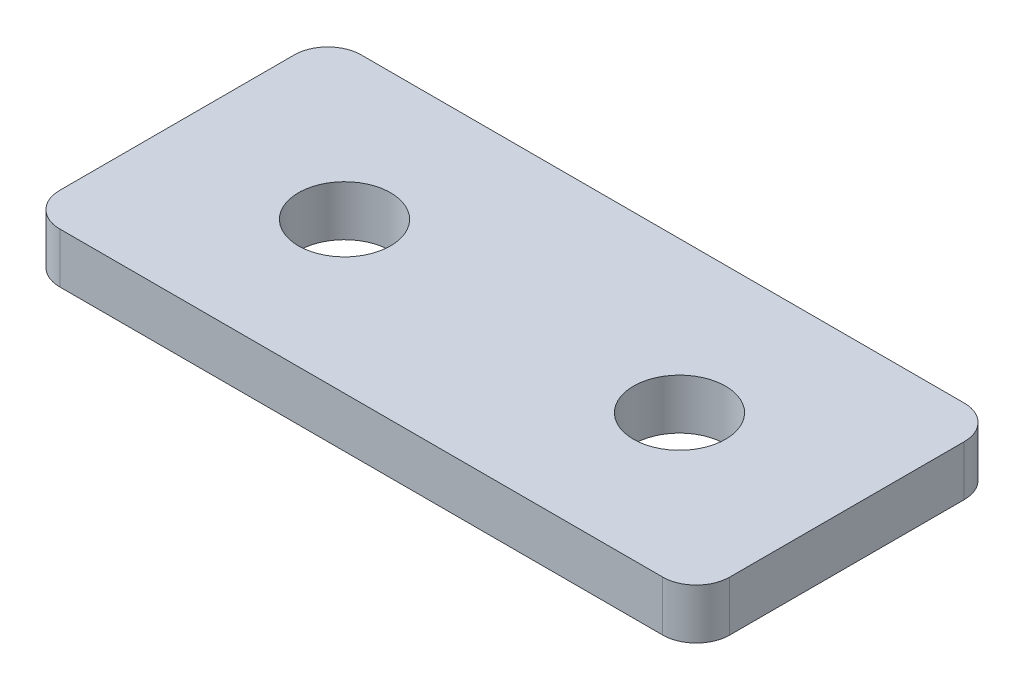
ISO-10303-21;
HEADER;
FILE_DESCRIPTION(('STEP AP214'),'2;1');
FILE_NAME('part.step','',(''),(''),'','','');
FILE_SCHEMA(('AUTOMOTIVE_DESIGN { 1 0 10303 214 1 1 1 1 }'));
ENDSEC;
DATA;
#1=APPLICATION_CONTEXT('core data for automotive mechanical design processes');
#2=APPLICATION_PROTOCOL_DEFINITION('international standard','automotive_design',2000,#1);
#3=PRODUCT_CONTEXT('',#1,'mechanical');
#4=PRODUCT('Part','Part','',(#3));
#5=PRODUCT_RELATED_PRODUCT_CATEGORY('part','',(#4));
#6=PRODUCT_DEFINITION_FORMATION('','',#4);
#7=PRODUCT_DEFINITION_CONTEXT('part definition',#1,'design');
#8=PRODUCT_DEFINITION('design','',#6,#7);
#9=PRODUCT_DEFINITION_SHAPE('','',#8);
#10=(LENGTH_UNIT() NAMED_UNIT(*) SI_UNIT(.MILLI.,.METRE.));
#11=(NAMED_UNIT(*) PLANE_ANGLE_UNIT() SI_UNIT($,.RADIAN.));
#12=(NAMED_UNIT(*) SI_UNIT($,.STERADIAN.) SOLID_ANGLE_UNIT());
#13=UNCERTAINTY_MEASURE_WITH_UNIT(LENGTH_MEASURE(1.E-05),#10,'distance_accuracy_value','');
#14=(GEOMETRIC_REPRESENTATION_CONTEXT(3) GLOBAL_UNCERTAINTY_ASSIGNED_CONTEXT((#13)) GLOBAL_UNIT_ASSIGNED_CONTEXT((#10,
#11,#12)) REPRESENTATION_CONTEXT('',''));
#15=CARTESIAN_POINT('',(0.,0.,0.));
#16=DIRECTION('',(0.,0.,1.));
#17=DIRECTION('',(1.,0.,0.));
#18=AXIS2_PLACEMENT_3D('',#15,#16,#17);
#19=CARTESIAN_POINT('',(18.,3.,-7.));
#20=DIRECTION('',(0.,-1.,0.));
#21=DIRECTION('',(0.,0.,-1.));
#22=AXIS2_PLACEMENT_3D('',#19,#20,#21);
#23=PLANE('',#22);
#24=CARTESIAN_POINT('',(18.,3.,-7.));
#25=DIRECTION('',(0.,1.,0.));
#26=DIRECTION('',(0.,0.,-1.));
#27=AXIS2_PLACEMENT_3D('',#24,#25,#26);
#28=CIRCLE('',#27,2.);
#29=CARTESIAN_POINT('',(20.,3.,-6.99999999999999));
#30=VERTEX_POINT('',#29);
#31=CARTESIAN_POINT('',(18.,3.,-9.));
#32=VERTEX_POINT('',#31);
#33=EDGE_CURVE('E170',#30,#32,#28,.T.);
#34=ORIENTED_EDGE('',*,*,#33,.T.);
#35=DIRECTION('',(-1.,0.,0.));
#36=VECTOR('',#35,1.);
#37=CARTESIAN_POINT('',(-18.,3.,-9.));
#38=LINE('',#37,#36);
#39=CARTESIAN_POINT('',(-18.,3.,-9.));
#40=VERTEX_POINT('',#39);
#41=EDGE_CURVE('E106',#32,#40,#38,.T.);
#42=ORIENTED_EDGE('',*,*,#41,.T.);
#43=CARTESIAN_POINT('',(-18.,3.,-7.));
#44=DIRECTION('',(0.,1.,0.));
#45=DIRECTION('',(0.,0.,-1.));
#46=AXIS2_PLACEMENT_3D('',#43,#44,#45);
#47=CIRCLE('',#46,2.);
#48=CARTESIAN_POINT('',(-20.,3.,-6.99999999999999));
#49=VERTEX_POINT('',#48);
#50=EDGE_CURVE('E191',#40,#49,#47,.T.);
#51=ORIENTED_EDGE('',*,*,#50,.T.);
#52=DIRECTION('',(0.,0.,1.));
#53=VECTOR('',#52,1.);
#54=CARTESIAN_POINT('',(-20.,3.,6.99999999999998));
#55=LINE('',#54,#53);
#56=CARTESIAN_POINT('',(-20.,3.,6.99999999999998));
#57=VERTEX_POINT('',#56);
#58=EDGE_CURVE('E205',#49,#57,#55,.T.);
#59=ORIENTED_EDGE('',*,*,#58,.T.);
#60=CARTESIAN_POINT('',(-18.,3.,7.));
#61=DIRECTION('',(0.,1.,0.));
#62=DIRECTION('',(0.,0.,-1.));
#63=AXIS2_PLACEMENT_3D('',#60,#61,#62);
#64=CIRCLE('',#63,2.);
#65=CARTESIAN_POINT('',(-18.,3.,9.));
#66=VERTEX_POINT('',#65);
#67=EDGE_CURVE('E125',#57,#66,#64,.T.);
#68=ORIENTED_EDGE('',*,*,#67,.T.);
#69=DIRECTION('',(1.,0.,0.));
#70=VECTOR('',#69,1.);
#71=CARTESIAN_POINT('',(-18.,3.,9.));
#72=LINE('',#71,#70);
#73=CARTESIAN_POINT('',(18.,3.,9.));
#74=VERTEX_POINT('',#73);
#75=EDGE_CURVE('E119',#66,#74,#72,.T.);
#76=ORIENTED_EDGE('',*,*,#75,.T.);
#77=CARTESIAN_POINT('',(18.,3.,7.));
#78=DIRECTION('',(0.,1.,0.));
#79=DIRECTION('',(0.,0.,-1.));
#80=AXIS2_PLACEMENT_3D('',#77,#78,#79);
#81=CIRCLE('',#80,2.);
#82=CARTESIAN_POINT('',(20.,3.,6.99999999999998));
#83=VERTEX_POINT('',#82);
#84=EDGE_CURVE('E123',#74,#83,#81,.T.);
#85=ORIENTED_EDGE('',*,*,#84,.T.);
#86=DIRECTION('',(0.,0.,-1.));
#87=VECTOR('',#86,1.);
#88=CARTESIAN_POINT('',(20.,3.,6.99999999999998));
#89=LINE('',#88,#87);
#90=EDGE_CURVE('E63',#83,#30,#89,.T.);
#91=ORIENTED_EDGE('',*,*,#90,.T.);
#92=EDGE_LOOP('',(#34,#42,#51,#59,#68,#76,#85,#91));
#93=FACE_BOUND('',#92,.T.);
#94=CARTESIAN_POINT('',(-10.,3.,0.));
#95=DIRECTION('',(0.,1.,0.));
#96=DIRECTION('',(0.,0.,1.));
#97=AXIS2_PLACEMENT_3D('',#94,#95,#96);
#98=CIRCLE('',#97,2.75);
#99=CARTESIAN_POINT('',(-10.,3.,2.75));
#100=VERTEX_POINT('',#99);
#101=EDGE_CURVE('E152',#100,#100,#98,.T.);
#102=ORIENTED_EDGE('',*,*,#101,.F.);
#103=EDGE_LOOP('',(#102));
#104=FACE_BOUND('',#103,.T.);
#105=CARTESIAN_POINT('',(10.,3.,0.));
#106=DIRECTION('',(0.,1.,0.));
#107=DIRECTION('',(0.,0.,1.));
#108=AXIS2_PLACEMENT_3D('',#105,#106,#107);
#109=CIRCLE('',#108,2.75);
#110=CARTESIAN_POINT('',(10.,3.,2.75));
#111=VERTEX_POINT('',#110);
#112=EDGE_CURVE('E219',#111,#111,#109,.T.);
#113=ORIENTED_EDGE('',*,*,#112,.F.);
#114=EDGE_LOOP('',(#113));
#115=FACE_BOUND('',#114,.T.);
#116=ADVANCED_FACE('F45',(#93,#104,#115),#23,.F.);
#117=CARTESIAN_POINT('',(18.,0.,-7.));
#118=DIRECTION('',(0.,-1.,0.));
#119=DIRECTION('',(0.,0.,-1.));
#120=AXIS2_PLACEMENT_3D('',#117,#118,#119);
#121=PLANE('',#120);
#122=CARTESIAN_POINT('',(-10.,0.,0.));
#123=DIRECTION('',(0.,1.,0.));
#124=DIRECTION('',(0.,0.,1.));
#125=AXIS2_PLACEMENT_3D('',#122,#123,#124);
#126=CIRCLE('',#125,2.75);
#127=CARTESIAN_POINT('',(-10.,0.,2.75));
#128=VERTEX_POINT('',#127);
#129=EDGE_CURVE('E215',#128,#128,#126,.T.);
#130=ORIENTED_EDGE('',*,*,#129,.T.);
#131=EDGE_LOOP('',(#130));
#132=FACE_BOUND('',#131,.T.);
#133=CARTESIAN_POINT('',(18.,0.,-7.));
#134=DIRECTION('',(0.,1.,0.));
#135=DIRECTION('',(0.,0.,-1.));
#136=AXIS2_PLACEMENT_3D('',#133,#134,#135);
#137=CIRCLE('',#136,2.);
#138=CARTESIAN_POINT('',(20.,0.,-6.99999999999999));
#139=VERTEX_POINT('',#138);
#140=CARTESIAN_POINT('',(18.,0.,-9.));
#141=VERTEX_POINT('',#140);
#142=EDGE_CURVE('E147',#139,#141,#137,.T.);
#143=ORIENTED_EDGE('',*,*,#142,.F.);
#144=DIRECTION('',(0.,0.,-1.));
#145=VECTOR('',#144,1.);
#146=CARTESIAN_POINT('',(20.,0.,6.99999999999998));
#147=LINE('',#146,#145);
#148=CARTESIAN_POINT('',(20.,0.,6.99999999999998));
#149=VERTEX_POINT('',#148);
#150=EDGE_CURVE('E98',#149,#139,#147,.T.);
#151=ORIENTED_EDGE('',*,*,#150,.F.);
#152=CARTESIAN_POINT('',(18.,0.,7.));
#153=DIRECTION('',(0.,1.,0.));
#154=DIRECTION('',(0.,0.,-1.));
#155=AXIS2_PLACEMENT_3D('',#152,#153,#154);
#156=CIRCLE('',#155,2.);
#157=CARTESIAN_POINT('',(18.,0.,9.));
#158=VERTEX_POINT('',#157);
#159=EDGE_CURVE('E92',#158,#149,#156,.T.);
#160=ORIENTED_EDGE('',*,*,#159,.F.);
#161=DIRECTION('',(1.,0.,0.));
#162=VECTOR('',#161,1.);
#163=CARTESIAN_POINT('',(-18.,0.,9.));
#164=LINE('',#163,#162);
#165=CARTESIAN_POINT('',(-18.,0.,9.));
#166=VERTEX_POINT('',#165);
#167=EDGE_CURVE('E134',#166,#158,#164,.T.);
#168=ORIENTED_EDGE('',*,*,#167,.F.);
#169=CARTESIAN_POINT('',(-18.,0.,7.));
#170=DIRECTION('',(0.,1.,0.));
#171=DIRECTION('',(0.,0.,-1.));
#172=AXIS2_PLACEMENT_3D('',#169,#170,#171);
#173=CIRCLE('',#172,2.);
#174=CARTESIAN_POINT('',(-20.,0.,6.99999999999998));
#175=VERTEX_POINT('',#174);
#176=EDGE_CURVE('E161',#175,#166,#173,.T.);
#177=ORIENTED_EDGE('',*,*,#176,.F.);
#178=DIRECTION('',(0.,0.,1.));
#179=VECTOR('',#178,1.);
#180=CARTESIAN_POINT('',(-20.,0.,6.99999999999998));
#181=LINE('',#180,#179);
#182=CARTESIAN_POINT('',(-20.,0.,-6.99999999999999));
#183=VERTEX_POINT('',#182);
#184=EDGE_CURVE('E158',#183,#175,#181,.T.);
#185=ORIENTED_EDGE('',*,*,#184,.F.);
#186=CARTESIAN_POINT('',(-18.,0.,-7.));
#187=DIRECTION('',(0.,1.,0.));
#188=DIRECTION('',(0.,0.,-1.));
#189=AXIS2_PLACEMENT_3D('',#186,#187,#188);
#190=CIRCLE('',#189,2.);
#191=CARTESIAN_POINT('',(-18.,0.,-9.));
#192=VERTEX_POINT('',#191);
#193=EDGE_CURVE('E155',#192,#183,#190,.T.);
#194=ORIENTED_EDGE('',*,*,#193,.F.);
#195=DIRECTION('',(-1.,0.,0.));
#196=VECTOR('',#195,1.);
#197=CARTESIAN_POINT('',(-18.,0.,-9.));
#198=LINE('',#197,#196);
#199=EDGE_CURVE('E151',#141,#192,#198,.T.);
#200=ORIENTED_EDGE('',*,*,#199,.F.);
#201=EDGE_LOOP('',(#143,#151,#160,#168,#177,#185,#194,#200));
#202=FACE_BOUND('',#201,.T.);
#203=CARTESIAN_POINT('',(10.,0.,0.));
#204=DIRECTION('',(0.,1.,0.));
#205=DIRECTION('',(0.,0.,1.));
#206=AXIS2_PLACEMENT_3D('',#203,#204,#205);
#207=CIRCLE('',#206,2.75);
#208=CARTESIAN_POINT('',(10.,0.,2.75));
#209=VERTEX_POINT('',#208);
#210=EDGE_CURVE('E223',#209,#209,#207,.T.);
#211=ORIENTED_EDGE('',*,*,#210,.T.);
#212=EDGE_LOOP('',(#211));
#213=FACE_BOUND('',#212,.T.);
#214=ADVANCED_FACE('F195',(#132,#202,#213),#121,.T.);
#215=CARTESIAN_POINT('',(18.,3.,-7.));
#216=DIRECTION('',(0.,-1.,0.));
#217=DIRECTION('',(0.,0.,-1.));
#218=AXIS2_PLACEMENT_3D('',#215,#216,#217);
#219=CYLINDRICAL_SURFACE('',#218,2.);
#220=ORIENTED_EDGE('',*,*,#142,.T.);
#221=DIRECTION('',(0.,-1.,0.));
#222=VECTOR('',#221,1.);
#223=CARTESIAN_POINT('',(18.,3.,-9.));
#224=LINE('',#223,#222);
#225=EDGE_CURVE('E11',#32,#141,#224,.T.);
#226=ORIENTED_EDGE('',*,*,#225,.F.);
#227=ORIENTED_EDGE('',*,*,#33,.F.);
#228=DIRECTION('',(0.,-1.,0.));
#229=VECTOR('',#228,1.);
#230=CARTESIAN_POINT('',(20.,3.,-6.99999999999999));
#231=LINE('',#230,#229);
#232=EDGE_CURVE('E143',#30,#139,#231,.T.);
#233=ORIENTED_EDGE('',*,*,#232,.T.);
#234=EDGE_LOOP('',(#220,#226,#227,#233));
#235=FACE_BOUND('',#234,.T.);
#236=ADVANCED_FACE('F47',(#235),#219,.T.);
#237=CARTESIAN_POINT('',(-18.,3.,-9.));
#238=DIRECTION('',(0.,0.,1.));
#239=DIRECTION('',(1.,0.,0.));
#240=AXIS2_PLACEMENT_3D('',#237,#238,#239);
#241=PLANE('',#240);
#242=ORIENTED_EDGE('',*,*,#199,.T.);
#243=DIRECTION('',(0.,-1.,0.));
#244=VECTOR('',#243,1.);
#245=CARTESIAN_POINT('',(-18.,3.,-9.));
#246=LINE('',#245,#244);
#247=EDGE_CURVE('E55',#40,#192,#246,.T.);
#248=ORIENTED_EDGE('',*,*,#247,.F.);
#249=ORIENTED_EDGE('',*,*,#41,.F.);
#250=ORIENTED_EDGE('',*,*,#225,.T.);
#251=EDGE_LOOP('',(#242,#248,#249,#250));
#252=FACE_BOUND('',#251,.T.);
#253=ADVANCED_FACE('F257',(#252),#241,.F.);
#254=CARTESIAN_POINT('',(-18.,3.,-7.));
#255=DIRECTION('',(0.,-1.,0.));
#256=DIRECTION('',(0.,0.,-1.));
#257=AXIS2_PLACEMENT_3D('',#254,#255,#256);
#258=CYLINDRICAL_SURFACE('',#257,2.);
#259=ORIENTED_EDGE('',*,*,#193,.T.);
#260=DIRECTION('',(0.,-1.,0.));
#261=VECTOR('',#260,1.);
#262=CARTESIAN_POINT('',(-20.,3.,-6.99999999999999));
#263=LINE('',#262,#261);
#264=EDGE_CURVE('E181',#49,#183,#263,.T.);
#265=ORIENTED_EDGE('',*,*,#264,.F.);
#266=ORIENTED_EDGE('',*,*,#50,.F.);
#267=ORIENTED_EDGE('',*,*,#247,.T.);
#268=EDGE_LOOP('',(#259,#265,#266,#267));
#269=FACE_BOUND('',#268,.T.);
#270=ADVANCED_FACE('F189',(#269),#258,.T.);
#271=CARTESIAN_POINT('',(-20.,3.,6.99999999999998));
#272=DIRECTION('',(1.,0.,0.));
#273=DIRECTION('',(0.,0.,-1.));
#274=AXIS2_PLACEMENT_3D('',#271,#272,#273);
#275=PLANE('',#274);
#276=ORIENTED_EDGE('',*,*,#184,.T.);
#277=DIRECTION('',(0.,-1.,0.));
#278=VECTOR('',#277,1.);
#279=CARTESIAN_POINT('',(-20.,3.,6.99999999999998));
#280=LINE('',#279,#278);
#281=EDGE_CURVE('E177',#57,#175,#280,.T.);
#282=ORIENTED_EDGE('',*,*,#281,.F.);
#283=ORIENTED_EDGE('',*,*,#58,.F.);
#284=ORIENTED_EDGE('',*,*,#264,.T.);
#285=EDGE_LOOP('',(#276,#282,#283,#284));
#286=FACE_BOUND('',#285,.T.);
#287=ADVANCED_FACE('F200',(#286),#275,.F.);
#288=CARTESIAN_POINT('',(-18.,3.,7.));
#289=DIRECTION('',(0.,-1.,0.));
#290=DIRECTION('',(0.,0.,-1.));
#291=AXIS2_PLACEMENT_3D('',#288,#289,#290);
#292=CYLINDRICAL_SURFACE('',#291,2.);
#293=ORIENTED_EDGE('',*,*,#176,.T.);
#294=DIRECTION('',(0.,-1.,0.));
#295=VECTOR('',#294,1.);
#296=CARTESIAN_POINT('',(-18.,3.,9.));
#297=LINE('',#296,#295);
#298=EDGE_CURVE('E136',#66,#166,#297,.T.);
#299=ORIENTED_EDGE('',*,*,#298,.F.);
#300=ORIENTED_EDGE('',*,*,#67,.F.);
#301=ORIENTED_EDGE('',*,*,#281,.T.);
#302=EDGE_LOOP('',(#293,#299,#300,#301));
#303=FACE_BOUND('',#302,.T.);
#304=ADVANCED_FACE('F203',(#303),#292,.T.);
#305=CARTESIAN_POINT('',(-18.,3.,9.));
#306=DIRECTION('',(0.,0.,-1.));
#307=DIRECTION('',(-1.,0.,0.));
#308=AXIS2_PLACEMENT_3D('',#305,#306,#307);
#309=PLANE('',#308);
#310=ORIENTED_EDGE('',*,*,#167,.T.);
#311=DIRECTION('',(0.,-1.,0.));
#312=VECTOR('',#311,1.);
#313=CARTESIAN_POINT('',(18.,3.,9.));
#314=LINE('',#313,#312);
#315=EDGE_CURVE('E131',#74,#158,#314,.T.);
#316=ORIENTED_EDGE('',*,*,#315,.F.);
#317=ORIENTED_EDGE('',*,*,#75,.F.);
#318=ORIENTED_EDGE('',*,*,#298,.T.);
#319=EDGE_LOOP('',(#310,#316,#317,#318));
#320=FACE_BOUND('',#319,.T.);
#321=ADVANCED_FACE('F132',(#320),#309,.F.);
#322=CARTESIAN_POINT('',(18.,3.,7.));
#323=DIRECTION('',(0.,-1.,0.));
#324=DIRECTION('',(0.,0.,-1.));
#325=AXIS2_PLACEMENT_3D('',#322,#323,#324);
#326=CYLINDRICAL_SURFACE('',#325,2.);
#327=ORIENTED_EDGE('',*,*,#159,.T.);
#328=DIRECTION('',(0.,-1.,0.));
#329=VECTOR('',#328,1.);
#330=CARTESIAN_POINT('',(20.,3.,6.99999999999998));
#331=LINE('',#330,#329);
#332=EDGE_CURVE('E137',#83,#149,#331,.T.);
#333=ORIENTED_EDGE('',*,*,#332,.F.);
#334=ORIENTED_EDGE('',*,*,#84,.F.);
#335=ORIENTED_EDGE('',*,*,#315,.T.);
#336=EDGE_LOOP('',(#327,#333,#334,#335));
#337=FACE_BOUND('',#336,.T.);
#338=ADVANCED_FACE('F139',(#337),#326,.T.);
#339=CARTESIAN_POINT('',(20.,3.,6.99999999999998));
#340=DIRECTION('',(-1.,0.,0.));
#341=DIRECTION('',(0.,0.,1.));
#342=AXIS2_PLACEMENT_3D('',#339,#340,#341);
#343=PLANE('',#342);
#344=ORIENTED_EDGE('',*,*,#150,.T.);
#345=ORIENTED_EDGE('',*,*,#232,.F.);
#346=ORIENTED_EDGE('',*,*,#90,.F.);
#347=ORIENTED_EDGE('',*,*,#332,.T.);
#348=EDGE_LOOP('',(#344,#345,#346,#347));
#349=FACE_BOUND('',#348,.T.);
#350=ADVANCED_FACE('F245',(#349),#343,.F.);
#351=CARTESIAN_POINT('',(-10.,3.,0.));
#352=DIRECTION('',(0.,-1.,0.));
#353=DIRECTION('',(0.,0.,-1.));
#354=AXIS2_PLACEMENT_3D('',#351,#352,#353);
#355=CYLINDRICAL_SURFACE('',#354,2.75);
#356=ORIENTED_EDGE('',*,*,#101,.T.);
#357=EDGE_LOOP('',(#356));
#358=FACE_BOUND('',#357,.T.);
#359=ORIENTED_EDGE('',*,*,#129,.F.);
#360=EDGE_LOOP('',(#359));
#361=FACE_BOUND('',#360,.T.);
#362=ADVANCED_FACE('F242',(#358,#361),#355,.F.);
#363=CARTESIAN_POINT('',(10.,3.,0.));
#364=DIRECTION('',(0.,-1.,0.));
#365=DIRECTION('',(0.,0.,-1.));
#366=AXIS2_PLACEMENT_3D('',#363,#364,#365);
#367=CYLINDRICAL_SURFACE('',#366,2.75);
#368=ORIENTED_EDGE('',*,*,#112,.T.);
#369=EDGE_LOOP('',(#368));
#370=FACE_BOUND('',#369,.T.);
#371=ORIENTED_EDGE('',*,*,#210,.F.);
#372=EDGE_LOOP('',(#371));
#373=FACE_BOUND('',#372,.T.);
#374=ADVANCED_FACE('F231',(#370,#373),#367,.F.);
#375=CLOSED_SHELL('',(#116,#214,#236,#253,#270,#287,#304,#321,#338,#350,#362,#374));
#376=MANIFOLD_SOLID_BREP('B2',#375);
#377=ADVANCED_BREP_SHAPE_REPRESENTATION('',(#18,#376),#14);
#378=SHAPE_DEFINITION_REPRESENTATION(#9,#377);
ENDSEC;
END-ISO-10303-21;
